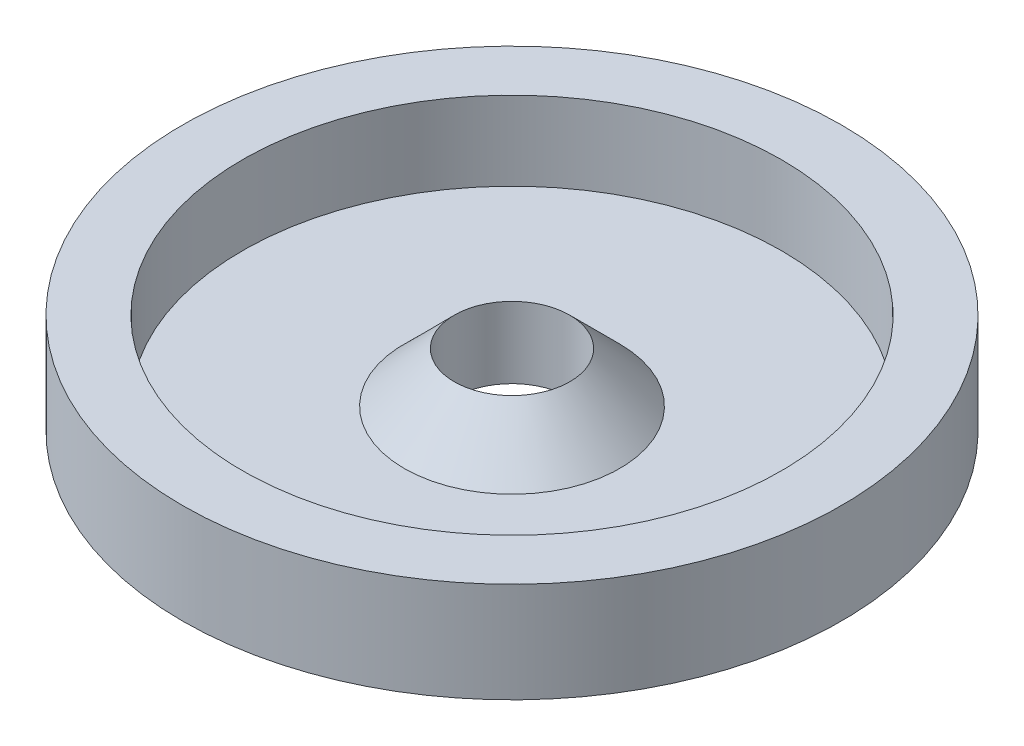
ISO-10303-21;
HEADER;
FILE_DESCRIPTION(('STEP AP214'),'2;1');
FILE_NAME('part.step','',(''),(''),'','','');
FILE_SCHEMA(('AUTOMOTIVE_DESIGN { 1 0 10303 214 1 1 1 1 }'));
ENDSEC;
DATA;
#1=APPLICATION_CONTEXT('core data for automotive mechanical design processes');
#2=APPLICATION_PROTOCOL_DEFINITION('international standard','automotive_design',2000,#1);
#3=PRODUCT_CONTEXT('',#1,'mechanical');
#4=PRODUCT('Part','Part','',(#3));
#5=PRODUCT_RELATED_PRODUCT_CATEGORY('part','',(#4));
#6=PRODUCT_DEFINITION_FORMATION('','',#4);
#7=PRODUCT_DEFINITION_CONTEXT('part definition',#1,'design');
#8=PRODUCT_DEFINITION('design','',#6,#7);
#9=PRODUCT_DEFINITION_SHAPE('','',#8);
#10=(LENGTH_UNIT() NAMED_UNIT(*) SI_UNIT(.MILLI.,.METRE.));
#11=(NAMED_UNIT(*) PLANE_ANGLE_UNIT() SI_UNIT($,.RADIAN.));
#12=(NAMED_UNIT(*) SI_UNIT($,.STERADIAN.) SOLID_ANGLE_UNIT());
#13=UNCERTAINTY_MEASURE_WITH_UNIT(LENGTH_MEASURE(1.E-05),#10,'distance_accuracy_value','');
#14=(GEOMETRIC_REPRESENTATION_CONTEXT(3) GLOBAL_UNCERTAINTY_ASSIGNED_CONTEXT((#13)) GLOBAL_UNIT_ASSIGNED_CONTEXT((#10,
#11,#12)) REPRESENTATION_CONTEXT('',''));
#15=CARTESIAN_POINT('',(0.,0.,0.));
#16=DIRECTION('',(0.,0.,1.));
#17=DIRECTION('',(1.,0.,0.));
#18=AXIS2_PLACEMENT_3D('',#15,#16,#17);
#19=CARTESIAN_POINT('',(0.,-10.8626139817629,0.));
#20=DIRECTION('',(0.,-1.,0.));
#21=DIRECTION('',(0.,0.,-1.));
#22=AXIS2_PLACEMENT_3D('',#19,#20,#21);
#23=CYLINDRICAL_SURFACE('',#22,21.4);
#24=CARTESIAN_POINT('',(0.,6.5,0.));
#25=DIRECTION('',(0.,-1.,0.));
#26=DIRECTION('',(0.,0.,-1.));
#27=AXIS2_PLACEMENT_3D('',#24,#25,#26);
#28=CIRCLE('',#27,21.4);
#29=CARTESIAN_POINT('',(0.,6.5,-21.4));
#30=VERTEX_POINT('',#29);
#31=EDGE_CURVE('E10',#30,#30,#28,.T.);
#32=ORIENTED_EDGE('',*,*,#31,.T.);
#33=EDGE_LOOP('',(#32));
#34=FACE_BOUND('',#33,.T.);
#35=CARTESIAN_POINT('',(0.,0.,0.));
#36=DIRECTION('',(0.,-1.,0.));
#37=DIRECTION('',(0.,0.,-1.));
#38=AXIS2_PLACEMENT_3D('',#35,#36,#37);
#39=CIRCLE('',#38,21.4);
#40=CARTESIAN_POINT('',(0.,0.,-21.4));
#41=VERTEX_POINT('',#40);
#42=EDGE_CURVE('E67',#41,#41,#39,.T.);
#43=ORIENTED_EDGE('',*,*,#42,.F.);
#44=EDGE_LOOP('',(#43));
#45=FACE_BOUND('',#44,.T.);
#46=ADVANCED_FACE('F36',(#34,#45),#23,.T.);
#47=CARTESIAN_POINT('',(21.4,6.5,0.));
#48=DIRECTION('',(0.,1.,0.));
#49=DIRECTION('',(0.,0.,1.));
#50=AXIS2_PLACEMENT_3D('',#47,#48,#49);
#51=PLANE('',#50);
#52=CARTESIAN_POINT('',(0.,6.5,0.));
#53=DIRECTION('',(0.,-1.,0.));
#54=DIRECTION('',(0.,0.,-1.));
#55=AXIS2_PLACEMENT_3D('',#52,#53,#54);
#56=CIRCLE('',#55,17.5);
#57=CARTESIAN_POINT('',(0.,6.5,-17.5));
#58=VERTEX_POINT('',#57);
#59=EDGE_CURVE('E43',#58,#58,#56,.T.);
#60=ORIENTED_EDGE('',*,*,#59,.T.);
#61=EDGE_LOOP('',(#60));
#62=FACE_BOUND('',#61,.T.);
#63=ORIENTED_EDGE('',*,*,#31,.F.);
#64=EDGE_LOOP('',(#63));
#65=FACE_BOUND('',#64,.T.);
#66=ADVANCED_FACE('F76',(#62,#65),#51,.T.);
#67=CARTESIAN_POINT('',(0.,-10.8626139817629,0.));
#68=DIRECTION('',(0.,-1.,0.));
#69=DIRECTION('',(0.,0.,-1.));
#70=AXIS2_PLACEMENT_3D('',#67,#68,#69);
#71=CYLINDRICAL_SURFACE('',#70,17.5);
#72=CARTESIAN_POINT('',(0.,1.38,0.));
#73=DIRECTION('',(0.,-1.,0.));
#74=DIRECTION('',(0.,0.,-1.));
#75=AXIS2_PLACEMENT_3D('',#72,#73,#74);
#76=CIRCLE('',#75,17.5);
#77=CARTESIAN_POINT('',(0.,1.38,-17.5));
#78=VERTEX_POINT('',#77);
#79=EDGE_CURVE('E50',#78,#78,#76,.T.);
#80=ORIENTED_EDGE('',*,*,#79,.T.);
#81=EDGE_LOOP('',(#80));
#82=FACE_BOUND('',#81,.T.);
#83=ORIENTED_EDGE('',*,*,#59,.F.);
#84=EDGE_LOOP('',(#83));
#85=FACE_BOUND('',#84,.T.);
#86=ADVANCED_FACE('F79',(#82,#85),#71,.F.);
#87=CARTESIAN_POINT('',(17.5,1.38,0.));
#88=DIRECTION('',(0.,1.,0.));
#89=DIRECTION('',(0.,0.,1.));
#90=AXIS2_PLACEMENT_3D('',#87,#88,#89);
#91=PLANE('',#90);
#92=CARTESIAN_POINT('',(0.,1.38,0.));
#93=DIRECTION('',(0.,-1.,0.));
#94=DIRECTION('',(0.,0.,-1.));
#95=AXIS2_PLACEMENT_3D('',#92,#93,#94);
#96=CIRCLE('',#95,7.);
#97=CARTESIAN_POINT('',(0.,1.38,-7.));
#98=VERTEX_POINT('',#97);
#99=EDGE_CURVE('E54',#98,#98,#96,.T.);
#100=ORIENTED_EDGE('',*,*,#99,.T.);
#101=EDGE_LOOP('',(#100));
#102=FACE_BOUND('',#101,.T.);
#103=ORIENTED_EDGE('',*,*,#79,.F.);
#104=EDGE_LOOP('',(#103));
#105=FACE_BOUND('',#104,.T.);
#106=ADVANCED_FACE('F82',(#102,#105),#91,.T.);
#107=CARTESIAN_POINT('',(0.,1.38,0.));
#108=DIRECTION('',(0.,-1.,0.));
#109=DIRECTION('',(0.,0.,-1.));
#110=AXIS2_PLACEMENT_3D('',#107,#108,#109);
#111=CONICAL_SURFACE('',#110,7.,0.785398163397443);
#112=CARTESIAN_POINT('',(0.,4.63000000000003,0.));
#113=DIRECTION('',(0.,-1.,0.));
#114=DIRECTION('',(0.,0.,-1.));
#115=AXIS2_PLACEMENT_3D('',#112,#113,#114);
#116=CIRCLE('',#115,3.75);
#117=CARTESIAN_POINT('',(0.,4.63000000000003,-3.75));
#118=VERTEX_POINT('',#117);
#119=EDGE_CURVE('E60',#118,#118,#116,.T.);
#120=ORIENTED_EDGE('',*,*,#119,.T.);
#121=EDGE_LOOP('',(#120));
#122=FACE_BOUND('',#121,.T.);
#123=ORIENTED_EDGE('',*,*,#99,.F.);
#124=EDGE_LOOP('',(#123));
#125=FACE_BOUND('',#124,.T.);
#126=ADVANCED_FACE('F89',(#122,#125),#111,.T.);
#127=CARTESIAN_POINT('',(0.,-10.8626139817629,0.));
#128=DIRECTION('',(0.,-1.,0.));
#129=DIRECTION('',(0.,0.,-1.));
#130=AXIS2_PLACEMENT_3D('',#127,#128,#129);
#131=CYLINDRICAL_SURFACE('',#130,3.75);
#132=CARTESIAN_POINT('',(0.,0.,0.));
#133=DIRECTION('',(0.,-1.,0.));
#134=DIRECTION('',(0.,0.,-1.));
#135=AXIS2_PLACEMENT_3D('',#132,#133,#134);
#136=CIRCLE('',#135,3.75);
#137=CARTESIAN_POINT('',(0.,0.,-3.75));
#138=VERTEX_POINT('',#137);
#139=EDGE_CURVE('E64',#138,#138,#136,.T.);
#140=ORIENTED_EDGE('',*,*,#139,.T.);
#141=EDGE_LOOP('',(#140));
#142=FACE_BOUND('',#141,.T.);
#143=ORIENTED_EDGE('',*,*,#119,.F.);
#144=EDGE_LOOP('',(#143));
#145=FACE_BOUND('',#144,.T.);
#146=ADVANCED_FACE('F93',(#142,#145),#131,.F.);
#147=CARTESIAN_POINT('',(3.75,0.,0.));
#148=DIRECTION('',(0.,-1.,0.));
#149=DIRECTION('',(0.,0.,-1.));
#150=AXIS2_PLACEMENT_3D('',#147,#148,#149);
#151=PLANE('',#150);
#152=ORIENTED_EDGE('',*,*,#42,.T.);
#153=EDGE_LOOP('',(#152));
#154=FACE_BOUND('',#153,.T.);
#155=ORIENTED_EDGE('',*,*,#139,.F.);
#156=EDGE_LOOP('',(#155));
#157=FACE_BOUND('',#156,.T.);
#158=ADVANCED_FACE('F72',(#154,#157),#151,.T.);
#159=CLOSED_SHELL('',(#46,#66,#86,#106,#126,#146,#158));
#160=MANIFOLD_SOLID_BREP('B2',#159);
#161=ADVANCED_BREP_SHAPE_REPRESENTATION('',(#18,#160),#14);
#162=SHAPE_DEFINITION_REPRESENTATION(#9,#161);
ENDSEC;
END-ISO-10303-21;
